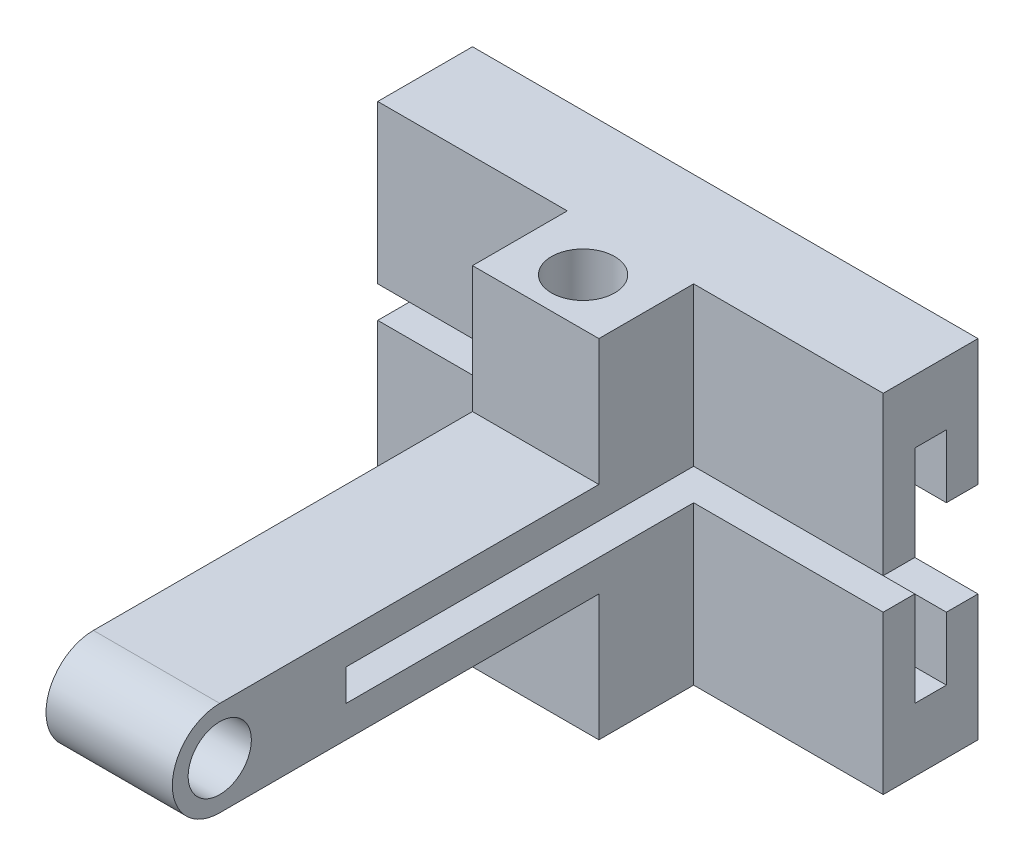
ISO-10303-21;
HEADER;
FILE_DESCRIPTION(('STEP AP214'),'2;1');
FILE_NAME('part.step','',(''),(''),'','','');
FILE_SCHEMA(('AUTOMOTIVE_DESIGN { 1 0 10303 214 1 1 1 1 }'));
ENDSEC;
DATA;
#1=APPLICATION_CONTEXT('core data for automotive mechanical design processes');
#2=APPLICATION_PROTOCOL_DEFINITION('international standard','automotive_design',2000,#1);
#3=PRODUCT_CONTEXT('',#1,'mechanical');
#4=PRODUCT('Part','Part','',(#3));
#5=PRODUCT_RELATED_PRODUCT_CATEGORY('part','',(#4));
#6=PRODUCT_DEFINITION_FORMATION('','',#4);
#7=PRODUCT_DEFINITION_CONTEXT('part definition',#1,'design');
#8=PRODUCT_DEFINITION('design','',#6,#7);
#9=PRODUCT_DEFINITION_SHAPE('','',#8);
#10=(LENGTH_UNIT() NAMED_UNIT(*) SI_UNIT(.MILLI.,.METRE.));
#11=(NAMED_UNIT(*) PLANE_ANGLE_UNIT() SI_UNIT($,.RADIAN.));
#12=(NAMED_UNIT(*) SI_UNIT($,.STERADIAN.) SOLID_ANGLE_UNIT());
#13=UNCERTAINTY_MEASURE_WITH_UNIT(LENGTH_MEASURE(1.E-05),#10,'distance_accuracy_value','');
#14=(GEOMETRIC_REPRESENTATION_CONTEXT(3) GLOBAL_UNCERTAINTY_ASSIGNED_CONTEXT((#13)) GLOBAL_UNIT_ASSIGNED_CONTEXT((#10,
#11,#12)) REPRESENTATION_CONTEXT('',''));
#15=CARTESIAN_POINT('',(0.,0.,0.));
#16=DIRECTION('',(0.,0.,1.));
#17=DIRECTION('',(1.,0.,0.));
#18=AXIS2_PLACEMENT_3D('',#15,#16,#17);
#19=CARTESIAN_POINT('',(20.,15.,0.));
#20=DIRECTION('',(0.,1.,0.));
#21=DIRECTION('',(0.,0.,1.));
#22=AXIS2_PLACEMENT_3D('',#19,#20,#21);
#23=PLANE('',#22);
#24=DIRECTION('',(0.,0.,-1.));
#25=VECTOR('',#24,1.);
#26=CARTESIAN_POINT('',(-20.,15.,0.));
#27=LINE('',#26,#25);
#28=CARTESIAN_POINT('',(-20.,15.,0.));
#29=VERTEX_POINT('',#28);
#30=CARTESIAN_POINT('',(-20.,15.,-120.));
#31=VERTEX_POINT('',#30);
#32=EDGE_CURVE('E167',#29,#31,#27,.T.);
#33=ORIENTED_EDGE('',*,*,#32,.F.);
#34=DIRECTION('',(-1.,0.,0.));
#35=VECTOR('',#34,1.);
#36=CARTESIAN_POINT('',(20.,15.,0.));
#37=LINE('',#36,#35);
#38=CARTESIAN_POINT('',(20.,15.,0.));
#39=VERTEX_POINT('',#38);
#40=EDGE_CURVE('E11',#39,#29,#37,.T.);
#41=ORIENTED_EDGE('',*,*,#40,.F.);
#42=DIRECTION('',(0.,0.,-1.));
#43=VECTOR('',#42,1.);
#44=CARTESIAN_POINT('',(20.,15.,0.));
#45=LINE('',#44,#43);
#46=CARTESIAN_POINT('',(20.,15.,-120.));
#47=VERTEX_POINT('',#46);
#48=EDGE_CURVE('E197',#39,#47,#45,.T.);
#49=ORIENTED_EDGE('',*,*,#48,.T.);
#50=DIRECTION('',(-1.,0.,0.));
#51=VECTOR('',#50,1.);
#52=CARTESIAN_POINT('',(20.,15.,-120.));
#53=LINE('',#52,#51);
#54=EDGE_CURVE('E58',#47,#31,#53,.T.);
#55=ORIENTED_EDGE('',*,*,#54,.T.);
#56=EDGE_LOOP('',(#33,#41,#49,#55));
#57=FACE_BOUND('',#56,.T.);
#58=ADVANCED_FACE('F41',(#57),#23,.T.);
#59=CARTESIAN_POINT('',(20.,0.,0.));
#60=DIRECTION('',(-1.,0.,0.));
#61=DIRECTION('',(0.,0.,1.));
#62=AXIS2_PLACEMENT_3D('',#59,#60,#61);
#63=CYLINDRICAL_SURFACE('',#62,15.);
#64=CARTESIAN_POINT('',(-20.,0.,0.));
#65=DIRECTION('',(1.,0.,0.));
#66=DIRECTION('',(0.,0.,-1.));
#67=AXIS2_PLACEMENT_3D('',#64,#65,#66);
#68=CIRCLE('',#67,15.);
#69=CARTESIAN_POINT('',(-20.,-15.,0.));
#70=VERTEX_POINT('',#69);
#71=EDGE_CURVE('E169',#29,#70,#68,.T.);
#72=ORIENTED_EDGE('',*,*,#71,.T.);
#73=DIRECTION('',(-1.,0.,0.));
#74=VECTOR('',#73,1.);
#75=CARTESIAN_POINT('',(20.,-15.,0.));
#76=LINE('',#75,#74);
#77=CARTESIAN_POINT('',(20.,-15.,0.));
#78=VERTEX_POINT('',#77);
#79=EDGE_CURVE('E50',#78,#70,#76,.T.);
#80=ORIENTED_EDGE('',*,*,#79,.F.);
#81=CARTESIAN_POINT('',(20.,0.,0.));
#82=DIRECTION('',(1.,0.,0.));
#83=DIRECTION('',(0.,0.,-1.));
#84=AXIS2_PLACEMENT_3D('',#81,#82,#83);
#85=CIRCLE('',#84,15.);
#86=EDGE_CURVE('E244',#39,#78,#85,.T.);
#87=ORIENTED_EDGE('',*,*,#86,.F.);
#88=ORIENTED_EDGE('',*,*,#40,.T.);
#89=EDGE_LOOP('',(#72,#80,#87,#88));
#90=FACE_BOUND('',#89,.T.);
#91=ADVANCED_FACE('F425',(#90),#63,.T.);
#92=CARTESIAN_POINT('',(20.,-15.,0.));
#93=DIRECTION('',(0.,1.,0.));
#94=DIRECTION('',(0.,0.,1.));
#95=AXIS2_PLACEMENT_3D('',#92,#93,#94);
#96=PLANE('',#95);
#97=DIRECTION('',(0.,0.,-1.));
#98=VECTOR('',#97,1.);
#99=CARTESIAN_POINT('',(-20.,-15.,0.));
#100=LINE('',#99,#98);
#101=CARTESIAN_POINT('',(-20.,-15.,-120.));
#102=VERTEX_POINT('',#101);
#103=EDGE_CURVE('E171',#70,#102,#100,.T.);
#104=ORIENTED_EDGE('',*,*,#103,.T.);
#105=DIRECTION('',(-1.,0.,0.));
#106=VECTOR('',#105,1.);
#107=CARTESIAN_POINT('',(20.,-15.,-120.));
#108=LINE('',#107,#106);
#109=CARTESIAN_POINT('',(20.,-15.,-120.));
#110=VERTEX_POINT('',#109);
#111=EDGE_CURVE('E204',#110,#102,#108,.T.);
#112=ORIENTED_EDGE('',*,*,#111,.F.);
#113=DIRECTION('',(0.,0.,-1.));
#114=VECTOR('',#113,1.);
#115=CARTESIAN_POINT('',(20.,-15.,0.));
#116=LINE('',#115,#114);
#117=EDGE_CURVE('E214',#78,#110,#116,.T.);
#118=ORIENTED_EDGE('',*,*,#117,.F.);
#119=ORIENTED_EDGE('',*,*,#79,.T.);
#120=EDGE_LOOP('',(#104,#112,#118,#119));
#121=FACE_BOUND('',#120,.T.);
#122=ADVANCED_FACE('F212',(#121),#96,.F.);
#123=CARTESIAN_POINT('',(20.,0.,-120.));
#124=DIRECTION('',(0.,0.,-1.));
#125=DIRECTION('',(-1.,0.,0.));
#126=AXIS2_PLACEMENT_3D('',#123,#124,#125);
#127=PLANE('',#126);
#128=DIRECTION('',(0.,-1.,0.));
#129=VECTOR('',#128,1.);
#130=CARTESIAN_POINT('',(-20.,0.,-120.));
#131=LINE('',#130,#129);
#132=CARTESIAN_POINT('',(-20.,-55.,-120.));
#133=VERTEX_POINT('',#132);
#134=EDGE_CURVE('E173',#102,#133,#131,.T.);
#135=ORIENTED_EDGE('',*,*,#134,.T.);
#136=DIRECTION('',(-1.,0.,0.));
#137=VECTOR('',#136,1.);
#138=CARTESIAN_POINT('',(20.,-55.,-120.));
#139=LINE('',#138,#137);
#140=CARTESIAN_POINT('',(20.,-55.,-120.));
#141=VERTEX_POINT('',#140);
#142=EDGE_CURVE('E201',#141,#133,#139,.T.);
#143=ORIENTED_EDGE('',*,*,#142,.F.);
#144=DIRECTION('',(0.,-1.,0.));
#145=VECTOR('',#144,1.);
#146=CARTESIAN_POINT('',(20.,0.,-120.));
#147=LINE('',#146,#145);
#148=EDGE_CURVE('E238',#110,#141,#147,.T.);
#149=ORIENTED_EDGE('',*,*,#148,.F.);
#150=ORIENTED_EDGE('',*,*,#111,.T.);
#151=EDGE_LOOP('',(#135,#143,#149,#150));
#152=FACE_BOUND('',#151,.T.);
#153=ADVANCED_FACE('F225',(#152),#127,.F.);
#154=CARTESIAN_POINT('',(20.,-55.,0.));
#155=DIRECTION('',(0.,1.,0.));
#156=DIRECTION('',(0.,0.,1.));
#157=AXIS2_PLACEMENT_3D('',#154,#155,#156);
#158=PLANE('',#157);
#159=CARTESIAN_POINT('',(0.,-55.,-135.));
#160=DIRECTION('',(0.,1.,0.));
#161=DIRECTION('',(0.,0.,1.));
#162=AXIS2_PLACEMENT_3D('',#159,#160,#161);
#163=CIRCLE('',#162,10.);
#164=CARTESIAN_POINT('',(0.,-55.,-125.));
#165=VERTEX_POINT('',#164);
#166=EDGE_CURVE('E397',#165,#165,#163,.T.);
#167=ORIENTED_EDGE('',*,*,#166,.T.);
#168=EDGE_LOOP('',(#167));
#169=FACE_BOUND('',#168,.T.);
#170=DIRECTION('',(0.,0.,-1.));
#171=VECTOR('',#170,1.);
#172=CARTESIAN_POINT('',(-20.,-55.,0.));
#173=LINE('',#172,#171);
#174=CARTESIAN_POINT('',(-20.,-55.,-150.));
#175=VERTEX_POINT('',#174);
#176=EDGE_CURVE('E175',#133,#175,#173,.T.);
#177=ORIENTED_EDGE('',*,*,#176,.T.);
#178=DIRECTION('',(-1.,0.,0.));
#179=VECTOR('',#178,1.);
#180=CARTESIAN_POINT('',(80.,-55.,-150.));
#181=LINE('',#180,#179);
#182=CARTESIAN_POINT('',(-80.,-55.,-150.));
#183=VERTEX_POINT('',#182);
#184=EDGE_CURVE('E256',#175,#183,#181,.T.);
#185=ORIENTED_EDGE('',*,*,#184,.T.);
#186=DIRECTION('',(0.,0.,-1.));
#187=VECTOR('',#186,1.);
#188=CARTESIAN_POINT('',(-80.,-55.0000000000001,0.));
#189=LINE('',#188,#187);
#190=CARTESIAN_POINT('',(-80.,-55.,-180.));
#191=VERTEX_POINT('',#190);
#192=EDGE_CURVE('E286',#183,#191,#189,.T.);
#193=ORIENTED_EDGE('',*,*,#192,.T.);
#194=DIRECTION('',(-1.,0.,0.));
#195=VECTOR('',#194,1.);
#196=CARTESIAN_POINT('',(80.,-55.,-180.));
#197=LINE('',#196,#195);
#198=CARTESIAN_POINT('',(80.,-55.,-180.));
#199=VERTEX_POINT('',#198);
#200=EDGE_CURVE('E257',#199,#191,#197,.T.);
#201=ORIENTED_EDGE('',*,*,#200,.F.);
#202=DIRECTION('',(0.,0.,-1.));
#203=VECTOR('',#202,1.);
#204=CARTESIAN_POINT('',(80.,-55.0000000000001,0.));
#205=LINE('',#204,#203);
#206=CARTESIAN_POINT('',(80.,-55.,-150.));
#207=VERTEX_POINT('',#206);
#208=EDGE_CURVE('E310',#207,#199,#205,.T.);
#209=ORIENTED_EDGE('',*,*,#208,.F.);
#210=CARTESIAN_POINT('',(20.,-55.,-150.));
#211=VERTEX_POINT('',#210);
#212=EDGE_CURVE('E235',#207,#211,#181,.T.);
#213=ORIENTED_EDGE('',*,*,#212,.T.);
#214=DIRECTION('',(0.,0.,-1.));
#215=VECTOR('',#214,1.);
#216=CARTESIAN_POINT('',(20.,-55.,0.));
#217=LINE('',#216,#215);
#218=EDGE_CURVE('E232',#141,#211,#217,.T.);
#219=ORIENTED_EDGE('',*,*,#218,.F.);
#220=ORIENTED_EDGE('',*,*,#142,.T.);
#221=EDGE_LOOP('',(#177,#185,#193,#201,#209,#213,#219,#220));
#222=FACE_BOUND('',#221,.T.);
#223=ADVANCED_FACE('F229',(#169,#222),#158,.F.);
#224=CARTESIAN_POINT('',(20.,-4.99999999999992,0.));
#225=DIRECTION('',(0.,-1.,0.));
#226=DIRECTION('',(0.,0.,-1.));
#227=AXIS2_PLACEMENT_3D('',#224,#225,#226);
#228=PLANE('',#227);
#229=CARTESIAN_POINT('',(0.,-4.99999999999998,-135.));
#230=DIRECTION('',(0.,-1.,0.));
#231=DIRECTION('',(0.,0.,-1.));
#232=AXIS2_PLACEMENT_3D('',#229,#230,#231);
#233=CIRCLE('',#232,10.);
#234=CARTESIAN_POINT('',(0.,-4.99999999999998,-145.));
#235=VERTEX_POINT('',#234);
#236=EDGE_CURVE('E298',#235,#235,#233,.T.);
#237=ORIENTED_EDGE('',*,*,#236,.T.);
#238=EDGE_LOOP('',(#237));
#239=FACE_BOUND('',#238,.T.);
#240=DIRECTION('',(0.,0.,1.));
#241=VECTOR('',#240,1.);
#242=CARTESIAN_POINT('',(-20.,-4.99999999999992,0.));
#243=LINE('',#242,#241);
#244=CARTESIAN_POINT('',(-20.,-4.99999999999998,-150.));
#245=VERTEX_POINT('',#244);
#246=CARTESIAN_POINT('',(-20.,-4.99999999999994,-40.));
#247=VERTEX_POINT('',#246);
#248=EDGE_CURVE('E180',#245,#247,#243,.T.);
#249=ORIENTED_EDGE('',*,*,#248,.T.);
#250=DIRECTION('',(-1.,0.,0.));
#251=VECTOR('',#250,1.);
#252=CARTESIAN_POINT('',(20.,-4.99999999999994,-40.));
#253=LINE('',#252,#251);
#254=CARTESIAN_POINT('',(20.,-4.99999999999994,-40.));
#255=VERTEX_POINT('',#254);
#256=EDGE_CURVE('E146',#255,#247,#253,.T.);
#257=ORIENTED_EDGE('',*,*,#256,.F.);
#258=DIRECTION('',(0.,0.,1.));
#259=VECTOR('',#258,1.);
#260=CARTESIAN_POINT('',(20.,-4.99999999999992,0.));
#261=LINE('',#260,#259);
#262=CARTESIAN_POINT('',(20.,-4.99999999999998,-150.));
#263=VERTEX_POINT('',#262);
#264=EDGE_CURVE('E133',#263,#255,#261,.T.);
#265=ORIENTED_EDGE('',*,*,#264,.F.);
#266=DIRECTION('',(-1.,0.,0.));
#267=VECTOR('',#266,1.);
#268=CARTESIAN_POINT('',(80.,-4.99999999999998,-150.));
#269=LINE('',#268,#267);
#270=CARTESIAN_POINT('',(80.,-4.99999999999998,-150.));
#271=VERTEX_POINT('',#270);
#272=EDGE_CURVE('E251',#271,#263,#269,.T.);
#273=ORIENTED_EDGE('',*,*,#272,.F.);
#274=DIRECTION('',(0.,0.,1.));
#275=VECTOR('',#274,1.);
#276=CARTESIAN_POINT('',(80.,-4.99999999999998,0.));
#277=LINE('',#276,#275);
#278=CARTESIAN_POINT('',(80.,-4.99999999999998,-160.));
#279=VERTEX_POINT('',#278);
#280=EDGE_CURVE('E316',#279,#271,#277,.T.);
#281=ORIENTED_EDGE('',*,*,#280,.F.);
#282=DIRECTION('',(-1.,0.,0.));
#283=VECTOR('',#282,1.);
#284=CARTESIAN_POINT('',(80.,-4.99999999999998,-160.));
#285=LINE('',#284,#283);
#286=CARTESIAN_POINT('',(-80.,-4.99999999999998,-160.));
#287=VERTEX_POINT('',#286);
#288=EDGE_CURVE('E247',#279,#287,#285,.T.);
#289=ORIENTED_EDGE('',*,*,#288,.T.);
#290=DIRECTION('',(0.,0.,1.));
#291=VECTOR('',#290,1.);
#292=CARTESIAN_POINT('',(-80.,-4.99999999999998,0.));
#293=LINE('',#292,#291);
#294=CARTESIAN_POINT('',(-80.,-4.99999999999998,-150.));
#295=VERTEX_POINT('',#294);
#296=EDGE_CURVE('E292',#287,#295,#293,.T.);
#297=ORIENTED_EDGE('',*,*,#296,.T.);
#298=EDGE_CURVE('E254',#245,#295,#269,.T.);
#299=ORIENTED_EDGE('',*,*,#298,.F.);
#300=EDGE_LOOP('',(#249,#257,#265,#273,#281,#289,#297,#299));
#301=FACE_BOUND('',#300,.T.);
#302=ADVANCED_FACE('F438',(#239,#301),#228,.F.);
#303=CARTESIAN_POINT('',(20.,0.,-40.));
#304=DIRECTION('',(0.,0.,1.));
#305=DIRECTION('',(1.,0.,0.));
#306=AXIS2_PLACEMENT_3D('',#303,#304,#305);
#307=PLANE('',#306);
#308=DIRECTION('',(0.,1.,0.));
#309=VECTOR('',#308,1.);
#310=CARTESIAN_POINT('',(-20.,0.,-40.));
#311=LINE('',#310,#309);
#312=CARTESIAN_POINT('',(-20.,5.00000000000006,-40.));
#313=VERTEX_POINT('',#312);
#314=EDGE_CURVE('E142',#247,#313,#311,.T.);
#315=ORIENTED_EDGE('',*,*,#314,.T.);
#316=DIRECTION('',(-1.,0.,0.));
#317=VECTOR('',#316,1.);
#318=CARTESIAN_POINT('',(20.,5.00000000000006,-40.));
#319=LINE('',#318,#317);
#320=CARTESIAN_POINT('',(20.,5.00000000000006,-40.));
#321=VERTEX_POINT('',#320);
#322=EDGE_CURVE('E139',#321,#313,#319,.T.);
#323=ORIENTED_EDGE('',*,*,#322,.F.);
#324=DIRECTION('',(0.,1.,0.));
#325=VECTOR('',#324,1.);
#326=CARTESIAN_POINT('',(20.,0.,-40.));
#327=LINE('',#326,#325);
#328=EDGE_CURVE('E123',#255,#321,#327,.T.);
#329=ORIENTED_EDGE('',*,*,#328,.F.);
#330=ORIENTED_EDGE('',*,*,#256,.T.);
#331=EDGE_LOOP('',(#315,#323,#329,#330));
#332=FACE_BOUND('',#331,.T.);
#333=ADVANCED_FACE('F140',(#332),#307,.F.);
#334=CARTESIAN_POINT('',(20.,5.0000000000001,0.));
#335=DIRECTION('',(0.,-1.,0.));
#336=DIRECTION('',(0.,0.,-1.));
#337=AXIS2_PLACEMENT_3D('',#334,#335,#336);
#338=PLANE('',#337);
#339=CARTESIAN_POINT('',(0.,5.,-135.));
#340=DIRECTION('',(0.,-1.,0.));
#341=DIRECTION('',(0.,0.,-1.));
#342=AXIS2_PLACEMENT_3D('',#339,#340,#341);
#343=CIRCLE('',#342,10.);
#344=CARTESIAN_POINT('',(0.,4.99999999999999,-145.));
#345=VERTEX_POINT('',#344);
#346=EDGE_CURVE('E394',#345,#345,#343,.T.);
#347=ORIENTED_EDGE('',*,*,#346,.F.);
#348=EDGE_LOOP('',(#347));
#349=FACE_BOUND('',#348,.T.);
#350=DIRECTION('',(0.,0.,1.));
#351=VECTOR('',#350,1.);
#352=CARTESIAN_POINT('',(-20.,5.0000000000001,0.));
#353=LINE('',#352,#351);
#354=CARTESIAN_POINT('',(-20.,4.99999999999998,-150.));
#355=VERTEX_POINT('',#354);
#356=EDGE_CURVE('E183',#355,#313,#353,.T.);
#357=ORIENTED_EDGE('',*,*,#356,.F.);
#358=DIRECTION('',(-1.,0.,0.));
#359=VECTOR('',#358,1.);
#360=CARTESIAN_POINT('',(80.,4.99999999999998,-150.));
#361=LINE('',#360,#359);
#362=CARTESIAN_POINT('',(-80.,4.99999999999998,-150.));
#363=VERTEX_POINT('',#362);
#364=EDGE_CURVE('E322',#355,#363,#361,.T.);
#365=ORIENTED_EDGE('',*,*,#364,.T.);
#366=DIRECTION('',(0.,0.,-1.));
#367=VECTOR('',#366,1.);
#368=CARTESIAN_POINT('',(-80.,4.99999999999998,0.));
#369=LINE('',#368,#367);
#370=CARTESIAN_POINT('',(-80.,4.99999999999998,-160.));
#371=VERTEX_POINT('',#370);
#372=EDGE_CURVE('E364',#363,#371,#369,.T.);
#373=ORIENTED_EDGE('',*,*,#372,.T.);
#374=DIRECTION('',(-1.,0.,0.));
#375=VECTOR('',#374,1.);
#376=CARTESIAN_POINT('',(80.,4.99999999999998,-160.));
#377=LINE('',#376,#375);
#378=CARTESIAN_POINT('',(80.,4.99999999999998,-160.));
#379=VERTEX_POINT('',#378);
#380=EDGE_CURVE('E323',#379,#371,#377,.T.);
#381=ORIENTED_EDGE('',*,*,#380,.F.);
#382=DIRECTION('',(0.,0.,-1.));
#383=VECTOR('',#382,1.);
#384=CARTESIAN_POINT('',(80.,4.99999999999998,0.));
#385=LINE('',#384,#383);
#386=CARTESIAN_POINT('',(80.,4.99999999999998,-150.));
#387=VERTEX_POINT('',#386);
#388=EDGE_CURVE('E387',#387,#379,#385,.T.);
#389=ORIENTED_EDGE('',*,*,#388,.F.);
#390=CARTESIAN_POINT('',(20.,4.99999999999998,-150.));
#391=VERTEX_POINT('',#390);
#392=EDGE_CURVE('E152',#387,#391,#361,.T.);
#393=ORIENTED_EDGE('',*,*,#392,.T.);
#394=DIRECTION('',(0.,0.,1.));
#395=VECTOR('',#394,1.);
#396=CARTESIAN_POINT('',(20.,5.0000000000001,0.));
#397=LINE('',#396,#395);
#398=EDGE_CURVE('E131',#391,#321,#397,.T.);
#399=ORIENTED_EDGE('',*,*,#398,.T.);
#400=ORIENTED_EDGE('',*,*,#322,.T.);
#401=EDGE_LOOP('',(#357,#365,#373,#381,#389,#393,#399,#400));
#402=FACE_BOUND('',#401,.T.);
#403=ADVANCED_FACE('F149',(#349,#402),#338,.T.);
#404=CARTESIAN_POINT('',(20.,55.,0.));
#405=DIRECTION('',(0.,1.,0.));
#406=DIRECTION('',(0.,0.,1.));
#407=AXIS2_PLACEMENT_3D('',#404,#405,#406);
#408=PLANE('',#407);
#409=CARTESIAN_POINT('',(0.,55.,-135.));
#410=DIRECTION('',(0.,1.,0.));
#411=DIRECTION('',(0.,0.,1.));
#412=AXIS2_PLACEMENT_3D('',#409,#410,#411);
#413=CIRCLE('',#412,10.);
#414=CARTESIAN_POINT('',(0.,55.,-125.));
#415=VERTEX_POINT('',#414);
#416=EDGE_CURVE('E44',#415,#415,#413,.T.);
#417=ORIENTED_EDGE('',*,*,#416,.F.);
#418=EDGE_LOOP('',(#417));
#419=FACE_BOUND('',#418,.T.);
#420=DIRECTION('',(0.,0.,-1.));
#421=VECTOR('',#420,1.);
#422=CARTESIAN_POINT('',(-20.,55.,0.));
#423=LINE('',#422,#421);
#424=CARTESIAN_POINT('',(-20.,55.,-120.));
#425=VERTEX_POINT('',#424);
#426=CARTESIAN_POINT('',(-20.,55.,-150.));
#427=VERTEX_POINT('',#426);
#428=EDGE_CURVE('E188',#425,#427,#423,.T.);
#429=ORIENTED_EDGE('',*,*,#428,.F.);
#430=DIRECTION('',(-1.,0.,0.));
#431=VECTOR('',#430,1.);
#432=CARTESIAN_POINT('',(20.,55.,-120.));
#433=LINE('',#432,#431);
#434=CARTESIAN_POINT('',(20.,55.,-120.));
#435=VERTEX_POINT('',#434);
#436=EDGE_CURVE('E90',#435,#425,#433,.T.);
#437=ORIENTED_EDGE('',*,*,#436,.F.);
#438=DIRECTION('',(0.,0.,-1.));
#439=VECTOR('',#438,1.);
#440=CARTESIAN_POINT('',(20.,55.,0.));
#441=LINE('',#440,#439);
#442=CARTESIAN_POINT('',(20.,55.,-150.));
#443=VERTEX_POINT('',#442);
#444=EDGE_CURVE('E156',#435,#443,#441,.T.);
#445=ORIENTED_EDGE('',*,*,#444,.T.);
#446=DIRECTION('',(-1.,0.,0.));
#447=VECTOR('',#446,1.);
#448=CARTESIAN_POINT('',(80.,55.,-150.));
#449=LINE('',#448,#447);
#450=CARTESIAN_POINT('',(80.,55.,-150.));
#451=VERTEX_POINT('',#450);
#452=EDGE_CURVE('E341',#451,#443,#449,.T.);
#453=ORIENTED_EDGE('',*,*,#452,.F.);
#454=DIRECTION('',(0.,0.,-1.));
#455=VECTOR('',#454,1.);
#456=CARTESIAN_POINT('',(80.,55.0000000000001,0.));
#457=LINE('',#456,#455);
#458=CARTESIAN_POINT('',(80.,55.,-180.));
#459=VERTEX_POINT('',#458);
#460=EDGE_CURVE('E369',#451,#459,#457,.T.);
#461=ORIENTED_EDGE('',*,*,#460,.T.);
#462=DIRECTION('',(-1.,0.,0.));
#463=VECTOR('',#462,1.);
#464=CARTESIAN_POINT('',(80.,55.,-180.));
#465=LINE('',#464,#463);
#466=CARTESIAN_POINT('',(-80.,55.,-180.));
#467=VERTEX_POINT('',#466);
#468=EDGE_CURVE('E338',#459,#467,#465,.T.);
#469=ORIENTED_EDGE('',*,*,#468,.T.);
#470=DIRECTION('',(0.,0.,-1.));
#471=VECTOR('',#470,1.);
#472=CARTESIAN_POINT('',(-80.,55.0000000000001,0.));
#473=LINE('',#472,#471);
#474=CARTESIAN_POINT('',(-80.,55.,-150.));
#475=VERTEX_POINT('',#474);
#476=EDGE_CURVE('E345',#475,#467,#473,.T.);
#477=ORIENTED_EDGE('',*,*,#476,.F.);
#478=EDGE_CURVE('E344',#427,#475,#449,.T.);
#479=ORIENTED_EDGE('',*,*,#478,.F.);
#480=EDGE_LOOP('',(#429,#437,#445,#453,#461,#469,#477,#479));
#481=FACE_BOUND('',#480,.T.);
#482=ADVANCED_FACE('F406',(#419,#481),#408,.T.);
#483=CARTESIAN_POINT('',(20.,0.,-120.));
#484=DIRECTION('',(0.,0.,1.));
#485=DIRECTION('',(1.,0.,0.));
#486=AXIS2_PLACEMENT_3D('',#483,#484,#485);
#487=PLANE('',#486);
#488=DIRECTION('',(0.,1.,0.));
#489=VECTOR('',#488,1.);
#490=CARTESIAN_POINT('',(-20.,0.,-120.));
#491=LINE('',#490,#489);
#492=EDGE_CURVE('E191',#31,#425,#491,.T.);
#493=ORIENTED_EDGE('',*,*,#492,.F.);
#494=ORIENTED_EDGE('',*,*,#54,.F.);
#495=DIRECTION('',(0.,1.,0.));
#496=VECTOR('',#495,1.);
#497=CARTESIAN_POINT('',(20.,0.,-120.));
#498=LINE('',#497,#496);
#499=EDGE_CURVE('E162',#47,#435,#498,.T.);
#500=ORIENTED_EDGE('',*,*,#499,.T.);
#501=ORIENTED_EDGE('',*,*,#436,.T.);
#502=EDGE_LOOP('',(#493,#494,#500,#501));
#503=FACE_BOUND('',#502,.T.);
#504=ADVANCED_FACE('F409',(#503),#487,.T.);
#505=CARTESIAN_POINT('',(20.,0.,0.));
#506=DIRECTION('',(-1.,0.,0.));
#507=DIRECTION('',(0.,0.,1.));
#508=AXIS2_PLACEMENT_3D('',#505,#506,#507);
#509=CYLINDRICAL_SURFACE('',#508,10.);
#510=CARTESIAN_POINT('',(20.,0.,0.));
#511=DIRECTION('',(1.,0.,0.));
#512=DIRECTION('',(0.,0.,-1.));
#513=AXIS2_PLACEMENT_3D('',#510,#511,#512);
#514=CIRCLE('',#513,10.);
#515=CARTESIAN_POINT('',(20.,0.,-10.));
#516=VERTEX_POINT('',#515);
#517=EDGE_CURVE('E164',#516,#516,#514,.T.);
#518=ORIENTED_EDGE('',*,*,#517,.T.);
#519=EDGE_LOOP('',(#518));
#520=FACE_BOUND('',#519,.T.);
#521=CARTESIAN_POINT('',(-20.,0.,0.));
#522=DIRECTION('',(1.,0.,0.));
#523=DIRECTION('',(0.,0.,-1.));
#524=AXIS2_PLACEMENT_3D('',#521,#522,#523);
#525=CIRCLE('',#524,10.);
#526=CARTESIAN_POINT('',(-20.,0.,-10.));
#527=VERTEX_POINT('',#526);
#528=EDGE_CURVE('E194',#527,#527,#525,.T.);
#529=ORIENTED_EDGE('',*,*,#528,.F.);
#530=EDGE_LOOP('',(#529));
#531=FACE_BOUND('',#530,.T.);
#532=ADVANCED_FACE('F416',(#520,#531),#509,.F.);
#533=CARTESIAN_POINT('',(20.,0.,0.));
#534=DIRECTION('',(1.,0.,0.));
#535=DIRECTION('',(0.,0.,-1.));
#536=AXIS2_PLACEMENT_3D('',#533,#534,#535);
#537=PLANE('',#536);
#538=ORIENTED_EDGE('',*,*,#48,.F.);
#539=ORIENTED_EDGE('',*,*,#86,.T.);
#540=ORIENTED_EDGE('',*,*,#117,.T.);
#541=ORIENTED_EDGE('',*,*,#148,.T.);
#542=ORIENTED_EDGE('',*,*,#218,.T.);
#543=DIRECTION('',(0.,1.,0.));
#544=VECTOR('',#543,1.);
#545=CARTESIAN_POINT('',(20.,0.,-150.));
#546=LINE('',#545,#544);
#547=EDGE_CURVE('E237',#211,#263,#546,.T.);
#548=ORIENTED_EDGE('',*,*,#547,.T.);
#549=ORIENTED_EDGE('',*,*,#264,.T.);
#550=ORIENTED_EDGE('',*,*,#328,.T.);
#551=ORIENTED_EDGE('',*,*,#398,.F.);
#552=DIRECTION('',(0.,-1.,0.));
#553=VECTOR('',#552,1.);
#554=CARTESIAN_POINT('',(20.,0.,-150.));
#555=LINE('',#554,#553);
#556=EDGE_CURVE('E153',#443,#391,#555,.T.);
#557=ORIENTED_EDGE('',*,*,#556,.F.);
#558=ORIENTED_EDGE('',*,*,#444,.F.);
#559=ORIENTED_EDGE('',*,*,#499,.F.);
#560=EDGE_LOOP('',(#538,#539,#540,#541,#542,#548,#549,#550,#551,#557,#558,#559));
#561=FACE_BOUND('',#560,.T.);
#562=ORIENTED_EDGE('',*,*,#517,.F.);
#563=EDGE_LOOP('',(#562));
#564=FACE_BOUND('',#563,.T.);
#565=ADVANCED_FACE('F126',(#561,#564),#537,.T.);
#566=CARTESIAN_POINT('',(-20.,0.,0.));
#567=DIRECTION('',(1.,0.,0.));
#568=DIRECTION('',(0.,0.,-1.));
#569=AXIS2_PLACEMENT_3D('',#566,#567,#568);
#570=PLANE('',#569);
#571=ORIENTED_EDGE('',*,*,#32,.T.);
#572=ORIENTED_EDGE('',*,*,#492,.T.);
#573=ORIENTED_EDGE('',*,*,#428,.T.);
#574=DIRECTION('',(0.,-1.,0.));
#575=VECTOR('',#574,1.);
#576=CARTESIAN_POINT('',(-20.,0.,-150.));
#577=LINE('',#576,#575);
#578=EDGE_CURVE('E185',#427,#355,#577,.T.);
#579=ORIENTED_EDGE('',*,*,#578,.T.);
#580=ORIENTED_EDGE('',*,*,#356,.T.);
#581=ORIENTED_EDGE('',*,*,#314,.F.);
#582=ORIENTED_EDGE('',*,*,#248,.F.);
#583=DIRECTION('',(0.,1.,0.));
#584=VECTOR('',#583,1.);
#585=CARTESIAN_POINT('',(-20.,0.,-150.));
#586=LINE('',#585,#584);
#587=EDGE_CURVE('E177',#175,#245,#586,.T.);
#588=ORIENTED_EDGE('',*,*,#587,.F.);
#589=ORIENTED_EDGE('',*,*,#176,.F.);
#590=ORIENTED_EDGE('',*,*,#134,.F.);
#591=ORIENTED_EDGE('',*,*,#103,.F.);
#592=ORIENTED_EDGE('',*,*,#71,.F.);
#593=EDGE_LOOP('',(#571,#572,#573,#579,#580,#581,#582,#588,#589,#590,#591,#592));
#594=FACE_BOUND('',#593,.T.);
#595=ORIENTED_EDGE('',*,*,#528,.T.);
#596=EDGE_LOOP('',(#595));
#597=FACE_BOUND('',#596,.T.);
#598=ADVANCED_FACE('F219',(#594,#597),#570,.F.);
#599=CARTESIAN_POINT('',(80.,0.,-150.));
#600=DIRECTION('',(0.,0.,1.));
#601=DIRECTION('',(1.,0.,0.));
#602=AXIS2_PLACEMENT_3D('',#599,#600,#601);
#603=PLANE('',#602);
#604=ORIENTED_EDGE('',*,*,#587,.T.);
#605=ORIENTED_EDGE('',*,*,#298,.T.);
#606=DIRECTION('',(0.,1.,0.));
#607=VECTOR('',#606,1.);
#608=CARTESIAN_POINT('',(-80.,0.,-150.));
#609=LINE('',#608,#607);
#610=EDGE_CURVE('E289',#183,#295,#609,.T.);
#611=ORIENTED_EDGE('',*,*,#610,.F.);
#612=ORIENTED_EDGE('',*,*,#184,.F.);
#613=EDGE_LOOP('',(#604,#605,#611,#612));
#614=FACE_BOUND('',#613,.T.);
#615=ADVANCED_FACE('F519',(#614),#603,.T.);
#616=CARTESIAN_POINT('',(80.,0.,-160.));
#617=DIRECTION('',(0.,0.,1.));
#618=DIRECTION('',(1.,0.,0.));
#619=AXIS2_PLACEMENT_3D('',#616,#617,#618);
#620=PLANE('',#619);
#621=DIRECTION('',(0.,1.,0.));
#622=VECTOR('',#621,1.);
#623=CARTESIAN_POINT('',(-80.,0.,-160.));
#624=LINE('',#623,#622);
#625=CARTESIAN_POINT('',(-80.,-35.,-160.));
#626=VERTEX_POINT('',#625);
#627=EDGE_CURVE('E295',#626,#287,#624,.T.);
#628=ORIENTED_EDGE('',*,*,#627,.T.);
#629=ORIENTED_EDGE('',*,*,#288,.F.);
#630=DIRECTION('',(0.,1.,0.));
#631=VECTOR('',#630,1.);
#632=CARTESIAN_POINT('',(80.,0.,-160.));
#633=LINE('',#632,#631);
#634=CARTESIAN_POINT('',(80.,-35.,-160.));
#635=VERTEX_POINT('',#634);
#636=EDGE_CURVE('E276',#635,#279,#633,.T.);
#637=ORIENTED_EDGE('',*,*,#636,.F.);
#638=DIRECTION('',(-1.,0.,0.));
#639=VECTOR('',#638,1.);
#640=CARTESIAN_POINT('',(80.,-35.,-160.));
#641=LINE('',#640,#639);
#642=EDGE_CURVE('E269',#635,#626,#641,.T.);
#643=ORIENTED_EDGE('',*,*,#642,.T.);
#644=EDGE_LOOP('',(#628,#629,#637,#643));
#645=FACE_BOUND('',#644,.T.);
#646=ADVANCED_FACE('F517',(#645),#620,.F.);
#647=ORIENTED_EDGE('',*,*,#272,.T.);
#648=ORIENTED_EDGE('',*,*,#547,.F.);
#649=ORIENTED_EDGE('',*,*,#212,.F.);
#650=DIRECTION('',(0.,1.,0.));
#651=VECTOR('',#650,1.);
#652=CARTESIAN_POINT('',(80.,0.,-150.));
#653=LINE('',#652,#651);
#654=EDGE_CURVE('E313',#207,#271,#653,.T.);
#655=ORIENTED_EDGE('',*,*,#654,.T.);
#656=EDGE_LOOP('',(#647,#648,#649,#655));
#657=FACE_BOUND('',#656,.T.);
#658=ADVANCED_FACE('F513',(#657),#603,.T.);
#659=CARTESIAN_POINT('',(80.,0.,-180.));
#660=DIRECTION('',(0.,0.,1.));
#661=DIRECTION('',(1.,0.,0.));
#662=AXIS2_PLACEMENT_3D('',#659,#660,#661);
#663=PLANE('',#662);
#664=DIRECTION('',(0.,1.,0.));
#665=VECTOR('',#664,1.);
#666=CARTESIAN_POINT('',(-80.,0.,-180.));
#667=LINE('',#666,#665);
#668=CARTESIAN_POINT('',(-80.,-15.,-180.));
#669=VERTEX_POINT('',#668);
#670=EDGE_CURVE('E283',#191,#669,#667,.T.);
#671=ORIENTED_EDGE('',*,*,#670,.T.);
#672=DIRECTION('',(-1.,0.,0.));
#673=VECTOR('',#672,1.);
#674=CARTESIAN_POINT('',(80.,-15.,-180.));
#675=LINE('',#674,#673);
#676=CARTESIAN_POINT('',(80.,-15.,-180.));
#677=VERTEX_POINT('',#676);
#678=EDGE_CURVE('E260',#677,#669,#675,.T.);
#679=ORIENTED_EDGE('',*,*,#678,.F.);
#680=DIRECTION('',(0.,1.,0.));
#681=VECTOR('',#680,1.);
#682=CARTESIAN_POINT('',(80.,0.,-180.));
#683=LINE('',#682,#681);
#684=EDGE_CURVE('E307',#199,#677,#683,.T.);
#685=ORIENTED_EDGE('',*,*,#684,.F.);
#686=ORIENTED_EDGE('',*,*,#200,.T.);
#687=EDGE_LOOP('',(#671,#679,#685,#686));
#688=FACE_BOUND('',#687,.T.);
#689=ADVANCED_FACE('F509',(#688),#663,.F.);
#690=CARTESIAN_POINT('',(80.,-15.,0.));
#691=DIRECTION('',(0.,-1.,0.));
#692=DIRECTION('',(0.,0.,-1.));
#693=AXIS2_PLACEMENT_3D('',#690,#691,#692);
#694=PLANE('',#693);
#695=DIRECTION('',(0.,0.,1.));
#696=VECTOR('',#695,1.);
#697=CARTESIAN_POINT('',(-80.,-15.,0.));
#698=LINE('',#697,#696);
#699=CARTESIAN_POINT('',(-80.,-15.,-170.));
#700=VERTEX_POINT('',#699);
#701=EDGE_CURVE('E280',#669,#700,#698,.T.);
#702=ORIENTED_EDGE('',*,*,#701,.T.);
#703=DIRECTION('',(-1.,0.,0.));
#704=VECTOR('',#703,1.);
#705=CARTESIAN_POINT('',(80.,-15.,-170.));
#706=LINE('',#705,#704);
#707=CARTESIAN_POINT('',(80.,-15.,-170.));
#708=VERTEX_POINT('',#707);
#709=EDGE_CURVE('E263',#708,#700,#706,.T.);
#710=ORIENTED_EDGE('',*,*,#709,.F.);
#711=DIRECTION('',(0.,0.,1.));
#712=VECTOR('',#711,1.);
#713=CARTESIAN_POINT('',(80.,-15.,0.));
#714=LINE('',#713,#712);
#715=EDGE_CURVE('E304',#677,#708,#714,.T.);
#716=ORIENTED_EDGE('',*,*,#715,.F.);
#717=ORIENTED_EDGE('',*,*,#678,.T.);
#718=EDGE_LOOP('',(#702,#710,#716,#717));
#719=FACE_BOUND('',#718,.T.);
#720=ADVANCED_FACE('F505',(#719),#694,.F.);
#721=CARTESIAN_POINT('',(80.,0.,-170.));
#722=DIRECTION('',(0.,0.,-1.));
#723=DIRECTION('',(-1.,0.,0.));
#724=AXIS2_PLACEMENT_3D('',#721,#722,#723);
#725=PLANE('',#724);
#726=DIRECTION('',(0.,-1.,0.));
#727=VECTOR('',#726,1.);
#728=CARTESIAN_POINT('',(-80.,0.,-170.));
#729=LINE('',#728,#727);
#730=CARTESIAN_POINT('',(-80.,-35.,-170.));
#731=VERTEX_POINT('',#730);
#732=EDGE_CURVE('E277',#700,#731,#729,.T.);
#733=ORIENTED_EDGE('',*,*,#732,.T.);
#734=DIRECTION('',(-1.,0.,0.));
#735=VECTOR('',#734,1.);
#736=CARTESIAN_POINT('',(80.,-35.,-170.));
#737=LINE('',#736,#735);
#738=CARTESIAN_POINT('',(80.,-35.,-170.));
#739=VERTEX_POINT('',#738);
#740=EDGE_CURVE('E266',#739,#731,#737,.T.);
#741=ORIENTED_EDGE('',*,*,#740,.F.);
#742=DIRECTION('',(0.,-1.,0.));
#743=VECTOR('',#742,1.);
#744=CARTESIAN_POINT('',(80.,0.,-170.));
#745=LINE('',#744,#743);
#746=EDGE_CURVE('E301',#708,#739,#745,.T.);
#747=ORIENTED_EDGE('',*,*,#746,.F.);
#748=ORIENTED_EDGE('',*,*,#709,.T.);
#749=EDGE_LOOP('',(#733,#741,#747,#748));
#750=FACE_BOUND('',#749,.T.);
#751=ADVANCED_FACE('F501',(#750),#725,.F.);
#752=CARTESIAN_POINT('',(80.,-35.,0.));
#753=DIRECTION('',(0.,-1.,0.));
#754=DIRECTION('',(0.,0.,-1.));
#755=AXIS2_PLACEMENT_3D('',#752,#753,#754);
#756=PLANE('',#755);
#757=DIRECTION('',(0.,0.,1.));
#758=VECTOR('',#757,1.);
#759=CARTESIAN_POINT('',(-80.,-35.,0.));
#760=LINE('',#759,#758);
#761=EDGE_CURVE('E273',#731,#626,#760,.T.);
#762=ORIENTED_EDGE('',*,*,#761,.T.);
#763=ORIENTED_EDGE('',*,*,#642,.F.);
#764=DIRECTION('',(0.,0.,1.));
#765=VECTOR('',#764,1.);
#766=CARTESIAN_POINT('',(80.,-35.,0.));
#767=LINE('',#766,#765);
#768=EDGE_CURVE('E272',#739,#635,#767,.T.);
#769=ORIENTED_EDGE('',*,*,#768,.F.);
#770=ORIENTED_EDGE('',*,*,#740,.T.);
#771=EDGE_LOOP('',(#762,#763,#769,#770));
#772=FACE_BOUND('',#771,.T.);
#773=ADVANCED_FACE('F494',(#772),#756,.F.);
#774=CARTESIAN_POINT('',(80.,0.,0.));
#775=DIRECTION('',(1.,0.,0.));
#776=DIRECTION('',(0.,0.,-1.));
#777=AXIS2_PLACEMENT_3D('',#774,#775,#776);
#778=PLANE('',#777);
#779=ORIENTED_EDGE('',*,*,#636,.T.);
#780=ORIENTED_EDGE('',*,*,#280,.T.);
#781=ORIENTED_EDGE('',*,*,#654,.F.);
#782=ORIENTED_EDGE('',*,*,#208,.T.);
#783=ORIENTED_EDGE('',*,*,#684,.T.);
#784=ORIENTED_EDGE('',*,*,#715,.T.);
#785=ORIENTED_EDGE('',*,*,#746,.T.);
#786=ORIENTED_EDGE('',*,*,#768,.T.);
#787=EDGE_LOOP('',(#779,#780,#781,#782,#783,#784,#785,#786));
#788=FACE_BOUND('',#787,.T.);
#789=ADVANCED_FACE('F490',(#788),#778,.T.);
#790=CARTESIAN_POINT('',(-80.,0.,0.));
#791=DIRECTION('',(1.,0.,0.));
#792=DIRECTION('',(0.,0.,-1.));
#793=AXIS2_PLACEMENT_3D('',#790,#791,#792);
#794=PLANE('',#793);
#795=ORIENTED_EDGE('',*,*,#627,.F.);
#796=ORIENTED_EDGE('',*,*,#761,.F.);
#797=ORIENTED_EDGE('',*,*,#732,.F.);
#798=ORIENTED_EDGE('',*,*,#701,.F.);
#799=ORIENTED_EDGE('',*,*,#670,.F.);
#800=ORIENTED_EDGE('',*,*,#192,.F.);
#801=ORIENTED_EDGE('',*,*,#610,.T.);
#802=ORIENTED_EDGE('',*,*,#296,.F.);
#803=EDGE_LOOP('',(#795,#796,#797,#798,#799,#800,#801,#802));
#804=FACE_BOUND('',#803,.T.);
#805=ADVANCED_FACE('F493',(#804),#794,.F.);
#806=CARTESIAN_POINT('',(80.,0.,-150.));
#807=DIRECTION('',(0.,0.,-1.));
#808=DIRECTION('',(-1.,0.,0.));
#809=AXIS2_PLACEMENT_3D('',#806,#807,#808);
#810=PLANE('',#809);
#811=ORIENTED_EDGE('',*,*,#364,.F.);
#812=ORIENTED_EDGE('',*,*,#578,.F.);
#813=ORIENTED_EDGE('',*,*,#478,.T.);
#814=DIRECTION('',(0.,-1.,0.));
#815=VECTOR('',#814,1.);
#816=CARTESIAN_POINT('',(-80.,0.,-150.));
#817=LINE('',#816,#815);
#818=EDGE_CURVE('E250',#475,#363,#817,.T.);
#819=ORIENTED_EDGE('',*,*,#818,.T.);
#820=EDGE_LOOP('',(#811,#812,#813,#819));
#821=FACE_BOUND('',#820,.T.);
#822=ADVANCED_FACE('F488',(#821),#810,.F.);
#823=ORIENTED_EDGE('',*,*,#556,.T.);
#824=ORIENTED_EDGE('',*,*,#392,.F.);
#825=DIRECTION('',(0.,-1.,0.));
#826=VECTOR('',#825,1.);
#827=CARTESIAN_POINT('',(80.,0.,-150.));
#828=LINE('',#827,#826);
#829=EDGE_CURVE('E348',#451,#387,#828,.T.);
#830=ORIENTED_EDGE('',*,*,#829,.F.);
#831=ORIENTED_EDGE('',*,*,#452,.T.);
#832=EDGE_LOOP('',(#823,#824,#830,#831));
#833=FACE_BOUND('',#832,.T.);
#834=ADVANCED_FACE('F484',(#833),#810,.F.);
#835=CARTESIAN_POINT('',(80.,0.,-160.));
#836=DIRECTION('',(0.,0.,-1.));
#837=DIRECTION('',(-1.,0.,0.));
#838=AXIS2_PLACEMENT_3D('',#835,#836,#837);
#839=PLANE('',#838);
#840=DIRECTION('',(0.,-1.,0.));
#841=VECTOR('',#840,1.);
#842=CARTESIAN_POINT('',(-80.,0.,-160.));
#843=LINE('',#842,#841);
#844=CARTESIAN_POINT('',(-80.,35.,-160.));
#845=VERTEX_POINT('',#844);
#846=EDGE_CURVE('E361',#845,#371,#843,.T.);
#847=ORIENTED_EDGE('',*,*,#846,.F.);
#848=DIRECTION('',(-1.,0.,0.));
#849=VECTOR('',#848,1.);
#850=CARTESIAN_POINT('',(80.,35.,-160.));
#851=LINE('',#850,#849);
#852=CARTESIAN_POINT('',(80.,35.,-160.));
#853=VERTEX_POINT('',#852);
#854=EDGE_CURVE('E326',#853,#845,#851,.T.);
#855=ORIENTED_EDGE('',*,*,#854,.F.);
#856=DIRECTION('',(0.,-1.,0.));
#857=VECTOR('',#856,1.);
#858=CARTESIAN_POINT('',(80.,0.,-160.));
#859=LINE('',#858,#857);
#860=EDGE_CURVE('E384',#853,#379,#859,.T.);
#861=ORIENTED_EDGE('',*,*,#860,.T.);
#862=ORIENTED_EDGE('',*,*,#380,.T.);
#863=EDGE_LOOP('',(#847,#855,#861,#862));
#864=FACE_BOUND('',#863,.T.);
#865=ADVANCED_FACE('F480',(#864),#839,.T.);
#866=CARTESIAN_POINT('',(80.,35.,0.));
#867=DIRECTION('',(0.,-1.,0.));
#868=DIRECTION('',(0.,0.,-1.));
#869=AXIS2_PLACEMENT_3D('',#866,#867,#868);
#870=PLANE('',#869);
#871=DIRECTION('',(0.,0.,1.));
#872=VECTOR('',#871,1.);
#873=CARTESIAN_POINT('',(-80.,35.,0.));
#874=LINE('',#873,#872);
#875=CARTESIAN_POINT('',(-80.,35.,-170.));
#876=VERTEX_POINT('',#875);
#877=EDGE_CURVE('E358',#876,#845,#874,.T.);
#878=ORIENTED_EDGE('',*,*,#877,.F.);
#879=DIRECTION('',(-1.,0.,0.));
#880=VECTOR('',#879,1.);
#881=CARTESIAN_POINT('',(80.,35.,-170.));
#882=LINE('',#881,#880);
#883=CARTESIAN_POINT('',(80.,35.,-170.));
#884=VERTEX_POINT('',#883);
#885=EDGE_CURVE('E329',#884,#876,#882,.T.);
#886=ORIENTED_EDGE('',*,*,#885,.F.);
#887=DIRECTION('',(0.,0.,1.));
#888=VECTOR('',#887,1.);
#889=CARTESIAN_POINT('',(80.,35.,0.));
#890=LINE('',#889,#888);
#891=EDGE_CURVE('E381',#884,#853,#890,.T.);
#892=ORIENTED_EDGE('',*,*,#891,.T.);
#893=ORIENTED_EDGE('',*,*,#854,.T.);
#894=EDGE_LOOP('',(#878,#886,#892,#893));
#895=FACE_BOUND('',#894,.T.);
#896=ADVANCED_FACE('F476',(#895),#870,.T.);
#897=CARTESIAN_POINT('',(80.,0.,-170.));
#898=DIRECTION('',(0.,0.,1.));
#899=DIRECTION('',(1.,0.,0.));
#900=AXIS2_PLACEMENT_3D('',#897,#898,#899);
#901=PLANE('',#900);
#902=DIRECTION('',(0.,1.,0.));
#903=VECTOR('',#902,1.);
#904=CARTESIAN_POINT('',(-80.,0.,-170.));
#905=LINE('',#904,#903);
#906=CARTESIAN_POINT('',(-80.,15.,-170.));
#907=VERTEX_POINT('',#906);
#908=EDGE_CURVE('E355',#907,#876,#905,.T.);
#909=ORIENTED_EDGE('',*,*,#908,.F.);
#910=DIRECTION('',(-1.,0.,0.));
#911=VECTOR('',#910,1.);
#912=CARTESIAN_POINT('',(80.,15.,-170.));
#913=LINE('',#912,#911);
#914=CARTESIAN_POINT('',(80.,15.,-170.));
#915=VERTEX_POINT('',#914);
#916=EDGE_CURVE('E332',#915,#907,#913,.T.);
#917=ORIENTED_EDGE('',*,*,#916,.F.);
#918=DIRECTION('',(0.,1.,0.));
#919=VECTOR('',#918,1.);
#920=CARTESIAN_POINT('',(80.,0.,-170.));
#921=LINE('',#920,#919);
#922=EDGE_CURVE('E378',#915,#884,#921,.T.);
#923=ORIENTED_EDGE('',*,*,#922,.T.);
#924=ORIENTED_EDGE('',*,*,#885,.T.);
#925=EDGE_LOOP('',(#909,#917,#923,#924));
#926=FACE_BOUND('',#925,.T.);
#927=ADVANCED_FACE('F472',(#926),#901,.T.);
#928=CARTESIAN_POINT('',(80.,15.,0.));
#929=DIRECTION('',(0.,-1.,0.));
#930=DIRECTION('',(0.,0.,-1.));
#931=AXIS2_PLACEMENT_3D('',#928,#929,#930);
#932=PLANE('',#931);
#933=DIRECTION('',(0.,0.,1.));
#934=VECTOR('',#933,1.);
#935=CARTESIAN_POINT('',(-80.,15.,0.));
#936=LINE('',#935,#934);
#937=CARTESIAN_POINT('',(-80.,15.,-180.));
#938=VERTEX_POINT('',#937);
#939=EDGE_CURVE('E352',#938,#907,#936,.T.);
#940=ORIENTED_EDGE('',*,*,#939,.F.);
#941=DIRECTION('',(-1.,0.,0.));
#942=VECTOR('',#941,1.);
#943=CARTESIAN_POINT('',(80.,15.,-180.));
#944=LINE('',#943,#942);
#945=CARTESIAN_POINT('',(80.,15.,-180.));
#946=VERTEX_POINT('',#945);
#947=EDGE_CURVE('E335',#946,#938,#944,.T.);
#948=ORIENTED_EDGE('',*,*,#947,.F.);
#949=DIRECTION('',(0.,0.,1.));
#950=VECTOR('',#949,1.);
#951=CARTESIAN_POINT('',(80.,15.,0.));
#952=LINE('',#951,#950);
#953=EDGE_CURVE('E375',#946,#915,#952,.T.);
#954=ORIENTED_EDGE('',*,*,#953,.T.);
#955=ORIENTED_EDGE('',*,*,#916,.T.);
#956=EDGE_LOOP('',(#940,#948,#954,#955));
#957=FACE_BOUND('',#956,.T.);
#958=ADVANCED_FACE('F468',(#957),#932,.T.);
#959=CARTESIAN_POINT('',(80.,0.,-180.));
#960=DIRECTION('',(0.,0.,-1.));
#961=DIRECTION('',(-1.,0.,0.));
#962=AXIS2_PLACEMENT_3D('',#959,#960,#961);
#963=PLANE('',#962);
#964=DIRECTION('',(0.,-1.,0.));
#965=VECTOR('',#964,1.);
#966=CARTESIAN_POINT('',(-80.,0.,-180.));
#967=LINE('',#966,#965);
#968=EDGE_CURVE('E349',#467,#938,#967,.T.);
#969=ORIENTED_EDGE('',*,*,#968,.F.);
#970=ORIENTED_EDGE('',*,*,#468,.F.);
#971=DIRECTION('',(0.,-1.,0.));
#972=VECTOR('',#971,1.);
#973=CARTESIAN_POINT('',(80.,0.,-180.));
#974=LINE('',#973,#972);
#975=EDGE_CURVE('E372',#459,#946,#974,.T.);
#976=ORIENTED_EDGE('',*,*,#975,.T.);
#977=ORIENTED_EDGE('',*,*,#947,.T.);
#978=EDGE_LOOP('',(#969,#970,#976,#977));
#979=FACE_BOUND('',#978,.T.);
#980=ADVANCED_FACE('F463',(#979),#963,.T.);
#981=CARTESIAN_POINT('',(80.,0.,0.));
#982=DIRECTION('',(1.,0.,0.));
#983=DIRECTION('',(0.,0.,-1.));
#984=AXIS2_PLACEMENT_3D('',#981,#982,#983);
#985=PLANE('',#984);
#986=ORIENTED_EDGE('',*,*,#829,.T.);
#987=ORIENTED_EDGE('',*,*,#388,.T.);
#988=ORIENTED_EDGE('',*,*,#860,.F.);
#989=ORIENTED_EDGE('',*,*,#891,.F.);
#990=ORIENTED_EDGE('',*,*,#922,.F.);
#991=ORIENTED_EDGE('',*,*,#953,.F.);
#992=ORIENTED_EDGE('',*,*,#975,.F.);
#993=ORIENTED_EDGE('',*,*,#460,.F.);
#994=EDGE_LOOP('',(#986,#987,#988,#989,#990,#991,#992,#993));
#995=FACE_BOUND('',#994,.T.);
#996=ADVANCED_FACE('F458',(#995),#985,.T.);
#997=CARTESIAN_POINT('',(-80.,0.,0.));
#998=DIRECTION('',(1.,0.,0.));
#999=DIRECTION('',(0.,0.,-1.));
#1000=AXIS2_PLACEMENT_3D('',#997,#998,#999);
#1001=PLANE('',#1000);
#1002=ORIENTED_EDGE('',*,*,#818,.F.);
#1003=ORIENTED_EDGE('',*,*,#476,.T.);
#1004=ORIENTED_EDGE('',*,*,#968,.T.);
#1005=ORIENTED_EDGE('',*,*,#939,.T.);
#1006=ORIENTED_EDGE('',*,*,#908,.T.);
#1007=ORIENTED_EDGE('',*,*,#877,.T.);
#1008=ORIENTED_EDGE('',*,*,#846,.T.);
#1009=ORIENTED_EDGE('',*,*,#372,.F.);
#1010=EDGE_LOOP('',(#1002,#1003,#1004,#1005,#1006,#1007,#1008,#1009));
#1011=FACE_BOUND('',#1010,.T.);
#1012=ADVANCED_FACE('F451',(#1011),#1001,.F.);
#1013=CARTESIAN_POINT('',(0.,-55.,-135.));
#1014=DIRECTION('',(0.,1.,0.));
#1015=DIRECTION('',(0.,0.,1.));
#1016=AXIS2_PLACEMENT_3D('',#1013,#1014,#1015);
#1017=CYLINDRICAL_SURFACE('',#1016,10.);
#1018=ORIENTED_EDGE('',*,*,#346,.T.);
#1019=EDGE_LOOP('',(#1018));
#1020=FACE_BOUND('',#1019,.T.);
#1021=ORIENTED_EDGE('',*,*,#416,.T.);
#1022=EDGE_LOOP('',(#1021));
#1023=FACE_BOUND('',#1022,.T.);
#1024=ADVANCED_FACE('F404',(#1020,#1023),#1017,.F.);
#1025=ORIENTED_EDGE('',*,*,#166,.F.);
#1026=EDGE_LOOP('',(#1025));
#1027=FACE_BOUND('',#1026,.T.);
#1028=ORIENTED_EDGE('',*,*,#236,.F.);
#1029=EDGE_LOOP('',(#1028));
#1030=FACE_BOUND('',#1029,.T.);
#1031=ADVANCED_FACE('F450',(#1027,#1030),#1017,.F.);
#1032=CLOSED_SHELL('',(#58,#91,#122,#153,#223,#302,#333,#403,#482,#504,#532,#565,#598,#615,#646,
#658,#689,#720,#751,#773,#789,#805,#822,#834,#865,#896,#927,#958,#980,#996,#1012,#1024,#1031));
#1033=MANIFOLD_SOLID_BREP('B2',#1032);
#1034=ADVANCED_BREP_SHAPE_REPRESENTATION('',(#18,#1033),#14);
#1035=SHAPE_DEFINITION_REPRESENTATION(#9,#1034);
ENDSEC;
END-ISO-10303-21;
